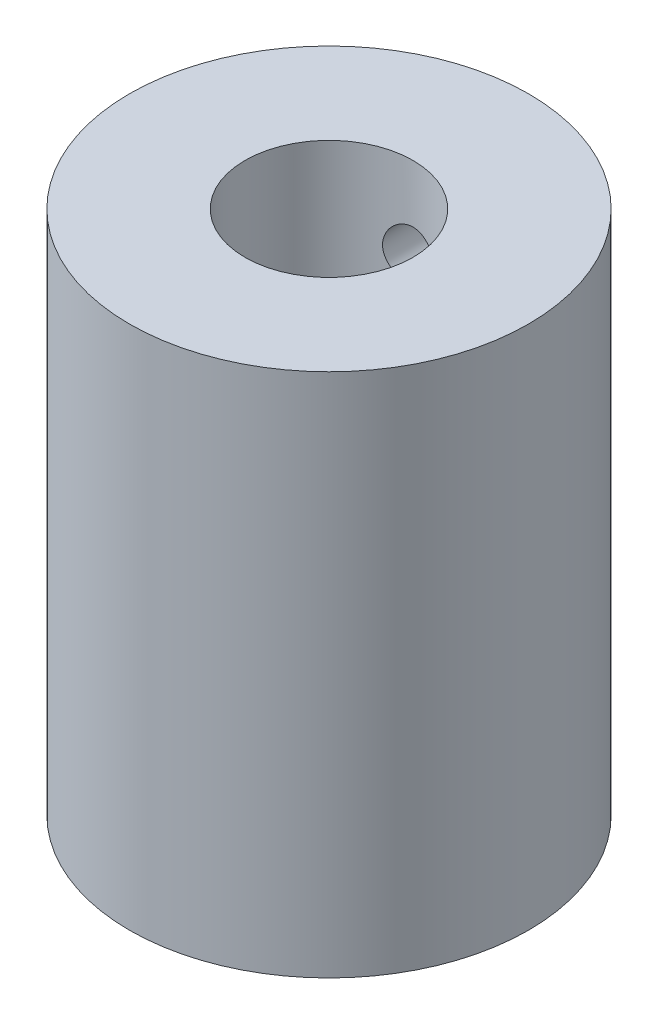
ISO-10303-21;
HEADER;
FILE_DESCRIPTION(('STEP AP214'),'2;1');
FILE_NAME('part.step','',(''),(''),'','','');
FILE_SCHEMA(('AUTOMOTIVE_DESIGN { 1 0 10303 214 1 1 1 1 }'));
ENDSEC;
DATA;
#1=APPLICATION_CONTEXT('core data for automotive mechanical design processes');
#2=APPLICATION_PROTOCOL_DEFINITION('international standard','automotive_design',2000,#1);
#3=PRODUCT_CONTEXT('',#1,'mechanical');
#4=PRODUCT('Part','Part','',(#3));
#5=PRODUCT_RELATED_PRODUCT_CATEGORY('part','',(#4));
#6=PRODUCT_DEFINITION_FORMATION('','',#4);
#7=PRODUCT_DEFINITION_CONTEXT('part definition',#1,'design');
#8=PRODUCT_DEFINITION('design','',#6,#7);
#9=PRODUCT_DEFINITION_SHAPE('','',#8);
#10=(LENGTH_UNIT() NAMED_UNIT(*) SI_UNIT(.MILLI.,.METRE.));
#11=(NAMED_UNIT(*) PLANE_ANGLE_UNIT() SI_UNIT($,.RADIAN.));
#12=(NAMED_UNIT(*) SI_UNIT($,.STERADIAN.) SOLID_ANGLE_UNIT());
#13=UNCERTAINTY_MEASURE_WITH_UNIT(LENGTH_MEASURE(1.E-05),#10,'distance_accuracy_value','');
#14=(GEOMETRIC_REPRESENTATION_CONTEXT(3) GLOBAL_UNCERTAINTY_ASSIGNED_CONTEXT((#13)) GLOBAL_UNIT_ASSIGNED_CONTEXT((#10,
#11,#12)) REPRESENTATION_CONTEXT('',''));
#15=CARTESIAN_POINT('',(0.,0.,0.));
#16=DIRECTION('',(0.,0.,1.));
#17=DIRECTION('',(1.,0.,0.));
#18=AXIS2_PLACEMENT_3D('',#15,#16,#17);
#19=CARTESIAN_POINT('',(0.,25.,0.));
#20=DIRECTION('',(0.,-1.,0.));
#21=DIRECTION('',(0.,0.,-1.));
#22=AXIS2_PLACEMENT_3D('',#19,#20,#21);
#23=CYLINDRICAL_SURFACE('',#22,9.5);
#24=CARTESIAN_POINT('',(0.,22.25,-9.5));
#25=CARTESIAN_POINT('',(-0.0698891577446907,22.249997050473,-9.49999898388699));
#26=CARTESIAN_POINT('',(-0.139821223747716,22.2441188373793,-9.49922063417787));
#27=CARTESIAN_POINT('',(-0.277737237008382,22.2207635020182,-9.49619052111643));
#28=CARTESIAN_POINT('',(-0.345719108974802,22.2032744693628,-9.49393724481659));
#29=CARTESIAN_POINT('',(-0.477718321462633,22.1572235295305,-9.48821096867027));
#30=CARTESIAN_POINT('',(-0.541738376084683,22.1286693023297,-9.4847388149622));
#31=CARTESIAN_POINT('',(-0.664066389164276,22.0613158272721,-9.47696034061076));
#32=CARTESIAN_POINT('',(-0.722375279132386,22.0225182539679,-9.47265415634291));
#33=CARTESIAN_POINT('',(-0.831991543439546,21.9355276905619,-9.46365868232214));
#34=CARTESIAN_POINT('',(-0.883259216449908,21.8872848697635,-9.45896744086581));
#35=CARTESIAN_POINT('',(-0.976995665734435,21.782880323665,-9.44974620597995));
#36=CARTESIAN_POINT('',(-1.01946398005465,21.7267181828718,-9.44521622102649));
#37=CARTESIAN_POINT('',(-1.09454581169274,21.6078089492471,-9.43681128294316));
#38=CARTESIAN_POINT('',(-1.1271218181455,21.5450379779733,-9.43293884705226));
#39=CARTESIAN_POINT('',(-1.18125473128303,21.4148566548344,-9.42631346347733));
#40=CARTESIAN_POINT('',(-1.20281210020545,21.3474464977203,-9.42356046883313));
#41=CARTESIAN_POINT('',(-1.23417446556436,21.2103138855888,-9.41950447444247));
#42=CARTESIAN_POINT('',(-1.24404675286152,21.1406070698532,-9.41819317554674));
#43=CARTESIAN_POINT('',(-1.25196699771812,21.0005147107269,-9.41714370405327));
#44=CARTESIAN_POINT('',(-1.25001548050153,20.930129197623,-9.41740546157894));
#45=CARTESIAN_POINT('',(-1.23439868875379,20.7911479510278,-9.41946493300181));
#46=CARTESIAN_POINT('',(-1.22080773813354,20.7225437010316,-9.4212529010043));
#47=CARTESIAN_POINT('',(-1.18241393441075,20.5885981186233,-9.42614812938148));
#48=CARTESIAN_POINT('',(-1.15761083179558,20.5232568588609,-9.42925541911596));
#49=CARTESIAN_POINT('',(-1.09741754548877,20.397462332422,-9.43645015999781));
#50=CARTESIAN_POINT('',(-1.06199526534778,20.3370246004947,-9.44054057510145));
#51=CARTESIAN_POINT('',(-0.981592067178582,20.2229230343496,-9.44923842883531));
#52=CARTESIAN_POINT('',(-0.936610665013907,20.1692595434432,-9.45384589364672));
#53=CARTESIAN_POINT('',(-0.837955139278335,20.0697985245393,-9.46310196431143));
#54=CARTESIAN_POINT('',(-0.784216991395047,20.0240644825594,-9.46775061467423));
#55=CARTESIAN_POINT('',(-0.669793294455651,19.9422555798297,-9.47653227200754));
#56=CARTESIAN_POINT('',(-0.609107726288853,19.906180745651,-9.48066527755955));
#57=CARTESIAN_POINT('',(-0.482461378646902,19.8447134565616,-9.48795293479305));
#58=CARTESIAN_POINT('',(-0.416498536315513,19.8193252034944,-9.49110720151756));
#59=CARTESIAN_POINT('',(-0.281195165615937,19.7800033282812,-9.49607856940107));
#60=CARTESIAN_POINT('',(-0.211854812774668,19.7660691115481,-9.49789573996917));
#61=CARTESIAN_POINT('',(-0.0723134207975204,19.7501336576661,-9.49997910680566));
#62=CARTESIAN_POINT('',(-0.00212252698949587,19.7480450090038,-9.50025666394529));
#63=CARTESIAN_POINT('',(0.137608332633313,19.7556289713268,-9.49926026666329));
#64=CARTESIAN_POINT('',(0.207148313805827,19.7653013041134,-9.49798634894085));
#65=CARTESIAN_POINT('',(0.343343754575,19.7960600295161,-9.4940372010179));
#66=CARTESIAN_POINT('',(0.410008839502246,19.8171045194689,-9.4913671163958));
#67=CARTESIAN_POINT('',(0.538863845308025,19.8699664656117,-9.48492442408429));
#68=CARTESIAN_POINT('',(0.601053599344464,19.901784323185,-9.48115177531735));
#69=CARTESIAN_POINT('',(0.719581517776561,19.9754997174083,-9.47289589414175));
#70=CARTESIAN_POINT('',(0.775884405799816,20.0174535289432,-9.46840874397782));
#71=CARTESIAN_POINT('',(0.880680914767181,20.1101706170332,-9.45923747369867));
#72=CARTESIAN_POINT('',(0.929174190660316,20.160934282627,-9.45455334489189));
#73=CARTESIAN_POINT('',(1.01728702566563,20.2702161629121,-9.4454807524801));
#74=CARTESIAN_POINT('',(1.05684847689665,20.3287814254935,-9.44109434790601));
#75=CARTESIAN_POINT('',(1.12557262175275,20.4517768382251,-9.43314836944188));
#76=CARTESIAN_POINT('',(1.15473554253827,20.5162068602184,-9.42958877749035));
#77=CARTESIAN_POINT('',(1.20174170294375,20.6489188776009,-9.42371371765608));
#78=CARTESIAN_POINT('',(1.21961716525157,20.7171892964293,-9.42139471115488));
#79=CARTESIAN_POINT('',(1.24364448346356,20.855795422781,-9.41825342941145));
#80=CARTESIAN_POINT('',(1.24979694873515,20.9261310227621,-9.4174310763725));
#81=CARTESIAN_POINT('',(1.25019162856568,21.0662926089517,-9.4173786418146));
#82=CARTESIAN_POINT('',(1.24452514640518,21.1361183509715,-9.41813635402617));
#83=CARTESIAN_POINT('',(1.22163669578697,21.2738155072501,-9.42113236258287));
#84=CARTESIAN_POINT('',(1.20441473040899,21.3416869220298,-9.42337065853341));
#85=CARTESIAN_POINT('',(1.15893367377168,21.4735334905478,-9.42907173824993));
#86=CARTESIAN_POINT('',(1.13067947521131,21.5375103569659,-9.43253397914272));
#87=CARTESIAN_POINT('',(1.06394495730012,21.6598298621194,-9.44029367351982));
#88=CARTESIAN_POINT('',(1.02546445538392,21.7181724002425,-9.44459114191468));
#89=CARTESIAN_POINT('',(0.93903254262036,21.8280332172149,-9.45357680022683));
#90=CARTESIAN_POINT('',(0.891013165736418,21.8794978116378,-9.45826764573149));
#91=CARTESIAN_POINT('',(0.787009174319997,21.9736727218722,-9.46748837677969));
#92=CARTESIAN_POINT('',(0.731022691916985,22.0163809790324,-9.47201822426547));
#93=CARTESIAN_POINT('',(0.612401395289747,22.0919861195341,-9.48042783846154));
#94=CARTESIAN_POINT('',(0.549739600834487,22.1248409679122,-9.48430478993119));
#95=CARTESIAN_POINT('',(0.419770486521843,22.1795136505256,-9.49094356757333));
#96=CARTESIAN_POINT('',(0.352468245550861,22.2013433403341,-9.4937065909269));
#97=CARTESIAN_POINT('',(0.237357221483918,22.2281872631123,-9.4971487575473));
#98=CARTESIAN_POINT('',(0.190270842343245,22.2363551034862,-9.4982126958584));
#99=CARTESIAN_POINT('',(0.0954629792925206,22.247262456279,-9.4996386611571));
#100=CARTESIAN_POINT('',(0.047741500783431,22.250002014831,-9.50000069410996));
#101=CARTESIAN_POINT('',(0.,22.25,-9.5));
#102=B_SPLINE_CURVE_WITH_KNOTS('',3,(#24,#25,#26,#27,#28,#29,#30,#31,#32,#33,#34,#35,#36,#37,
#38,#39,#40,#41,#42,#43,#44,#45,#46,#47,#48,#49,#50,#51,#52,#53,#54,#55,#56,#57,#58,#59,#60,#61,
#62,#63,#64,#65,#66,#67,#68,#69,#70,#71,#72,#73,#74,#75,#76,#77,#78,#79,#80,#81,#82,#83,#84,#85,
#86,#87,#88,#89,#90,#91,#92,#93,#94,#95,#96,#97,#98,#99,#100,#101),.UNSPECIFIED.,.T.,.F.,(4,2,2,
2,2,2,2,2,2,2,2,2,2,2,2,2,2,2,2,2,2,2,2,2,2,2,2,2,2,2,2,2,2,2,2,2,2,2,4),(0.,0.209493072375358,
0.419201375647517,0.628764387445856,0.838293161679495,1.04895868548499,1.25963526613331,
1.47110101760716,1.68255789725311,1.89279104241027,2.10301484889148,2.31190619019212,
2.52080218034093,2.73033603555644,2.93988050546709,3.15103211195918,3.36218429929279,
3.57341943191217,3.78464359847392,3.99430703870755,4.2039655195776,4.41285669353145,
4.62175565100023,4.83184220415876,5.04193803699637,5.25336364761438,5.46478463926429,
5.67559931873913,5.88640303965957,6.09558430110588,6.30476550680216,6.51385404763951,
6.72294632148713,6.93358560809511,7.14427436023559,7.35584953436963,7.56719671049371,
7.71030329529443,7.85340866387632),.UNSPECIFIED.);
#103=CARTESIAN_POINT('',(0.,22.25,-9.5));
#104=VERTEX_POINT('',#103);
#105=EDGE_CURVE('E60',#104,#104,#102,.T.);
#106=ORIENTED_EDGE('',*,*,#105,.T.);
#107=EDGE_LOOP('',(#106));
#108=FACE_BOUND('',#107,.T.);
#109=CARTESIAN_POINT('',(0.,5.25,-9.5));
#110=CARTESIAN_POINT('',(-0.0698891577446909,5.24999705047304,-9.49999898388699));
#111=CARTESIAN_POINT('',(-0.139821223747717,5.24411883737926,-9.49922063417787));
#112=CARTESIAN_POINT('',(-0.277737237008383,5.22076350201818,-9.49619052111643));
#113=CARTESIAN_POINT('',(-0.345719108974802,5.20327446936276,-9.49393724481659));
#114=CARTESIAN_POINT('',(-0.477718321462632,5.15722352953051,-9.48821096867027));
#115=CARTESIAN_POINT('',(-0.541738376084683,5.12866930232967,-9.4847388149622));
#116=CARTESIAN_POINT('',(-0.664066389164277,5.06131582727207,-9.47696034061076));
#117=CARTESIAN_POINT('',(-0.722375279132386,5.02251825396788,-9.47265415634291));
#118=CARTESIAN_POINT('',(-0.831991543439546,4.93552769056193,-9.46365868232214));
#119=CARTESIAN_POINT('',(-0.883259216449907,4.88728486976353,-9.45896744086581));
#120=CARTESIAN_POINT('',(-0.976995665734434,4.78288032366504,-9.44974620597995));
#121=CARTESIAN_POINT('',(-1.01946398005465,4.7267181828718,-9.44521622102649));
#122=CARTESIAN_POINT('',(-1.09454581169274,4.60780894924709,-9.43681128294316));
#123=CARTESIAN_POINT('',(-1.1271218181455,4.54503797797326,-9.43293884705226));
#124=CARTESIAN_POINT('',(-1.18125473128303,4.41485665483443,-9.42631346347733));
#125=CARTESIAN_POINT('',(-1.20281210020545,4.34744649772033,-9.42356046883313));
#126=CARTESIAN_POINT('',(-1.23417446556436,4.21031388558879,-9.41950447444247));
#127=CARTESIAN_POINT('',(-1.24404675286152,4.14060706985325,-9.41819317554674));
#128=CARTESIAN_POINT('',(-1.25196699771812,4.00051471072687,-9.41714370405327));
#129=CARTESIAN_POINT('',(-1.25001548050153,3.93012919762304,-9.41740546157894));
#130=CARTESIAN_POINT('',(-1.23439868875379,3.79114795102776,-9.41946493300181));
#131=CARTESIAN_POINT('',(-1.22080773813354,3.7225437010316,-9.4212529010043));
#132=CARTESIAN_POINT('',(-1.18241393441075,3.58859811862327,-9.42614812938148));
#133=CARTESIAN_POINT('',(-1.15761083179558,3.52325685886086,-9.42925541911596));
#134=CARTESIAN_POINT('',(-1.09741754548877,3.39746233242199,-9.43645015999781));
#135=CARTESIAN_POINT('',(-1.06199526534778,3.33702460049469,-9.44054057510145));
#136=CARTESIAN_POINT('',(-0.981592067178583,3.2229230343496,-9.44923842883531));
#137=CARTESIAN_POINT('',(-0.936610665013909,3.16925954344319,-9.45384589364672));
#138=CARTESIAN_POINT('',(-0.837955139278338,3.0697985245393,-9.46310196431143));
#139=CARTESIAN_POINT('',(-0.78421699139505,3.02406448255941,-9.46775061467423));
#140=CARTESIAN_POINT('',(-0.669793294455654,2.94225557982972,-9.47653227200753));
#141=CARTESIAN_POINT('',(-0.609107726288855,2.906180745651,-9.48066527755955));
#142=CARTESIAN_POINT('',(-0.482461378646903,2.84471345656164,-9.48795293479305));
#143=CARTESIAN_POINT('',(-0.416498536315515,2.81932520349437,-9.49110720151756));
#144=CARTESIAN_POINT('',(-0.281195165615939,2.78000332828116,-9.49607856940107));
#145=CARTESIAN_POINT('',(-0.21185481277467,2.7660691115481,-9.49789573996917));
#146=CARTESIAN_POINT('',(-0.0723134207975215,2.75013365766614,-9.49997910680566));
#147=CARTESIAN_POINT('',(-0.0021225269894969,2.74804500900382,-9.50025666394529));
#148=CARTESIAN_POINT('',(0.137608332633312,2.75562897132685,-9.49926026666329));
#149=CARTESIAN_POINT('',(0.207148313805826,2.7653013041134,-9.49798634894085));
#150=CARTESIAN_POINT('',(0.343343754574999,2.79606002951612,-9.4940372010179));
#151=CARTESIAN_POINT('',(0.410008839502246,2.81710451946888,-9.4913671163958));
#152=CARTESIAN_POINT('',(0.538863845308025,2.86996646561167,-9.48492442408429));
#153=CARTESIAN_POINT('',(0.601053599344464,2.90178432318504,-9.48115177531735));
#154=CARTESIAN_POINT('',(0.71958151777656,2.97549971740826,-9.47289589414175));
#155=CARTESIAN_POINT('',(0.775884405799814,3.01745352894318,-9.46840874397782));
#156=CARTESIAN_POINT('',(0.88068091476718,3.11017061703318,-9.45923747369867));
#157=CARTESIAN_POINT('',(0.929174190660315,3.16093428262702,-9.45455334489189));
#158=CARTESIAN_POINT('',(1.01728702566563,3.2702161629121,-9.4454807524801));
#159=CARTESIAN_POINT('',(1.05684847689665,3.32878142549349,-9.44109434790601));
#160=CARTESIAN_POINT('',(1.12557262175275,3.45177683822505,-9.43314836944188));
#161=CARTESIAN_POINT('',(1.15473554253827,3.51620686021838,-9.42958877749035));
#162=CARTESIAN_POINT('',(1.20174170294375,3.64891887760088,-9.42371371765608));
#163=CARTESIAN_POINT('',(1.21961716525157,3.71718929642928,-9.42139471115488));
#164=CARTESIAN_POINT('',(1.24364448346356,3.85579542278099,-9.41825342941145));
#165=CARTESIAN_POINT('',(1.24979694873515,3.92613102276212,-9.4174310763725));
#166=CARTESIAN_POINT('',(1.25019162856568,4.06629260895167,-9.4173786418146));
#167=CARTESIAN_POINT('',(1.24452514640518,4.13611835097151,-9.41813635402617));
#168=CARTESIAN_POINT('',(1.22163669578697,4.27381550725014,-9.42113236258287));
#169=CARTESIAN_POINT('',(1.20441473040899,4.34168692202977,-9.42337065853341));
#170=CARTESIAN_POINT('',(1.15893367377168,4.47353349054783,-9.42907173824993));
#171=CARTESIAN_POINT('',(1.13067947521131,4.5375103569659,-9.43253397914272));
#172=CARTESIAN_POINT('',(1.06394495730012,4.6598298621194,-9.44029367351982));
#173=CARTESIAN_POINT('',(1.02546445538392,4.71817240024245,-9.44459114191468));
#174=CARTESIAN_POINT('',(0.93903254262036,4.82803321721491,-9.45357680022683));
#175=CARTESIAN_POINT('',(0.891013165736418,4.87949781163776,-9.45826764573149));
#176=CARTESIAN_POINT('',(0.787009174319998,4.97367272187225,-9.46748837677969));
#177=CARTESIAN_POINT('',(0.731022691916986,5.01638097903239,-9.47201822426547));
#178=CARTESIAN_POINT('',(0.612401395289748,5.09198611953406,-9.48042783846154));
#179=CARTESIAN_POINT('',(0.549739600834487,5.12484096791219,-9.48430478993119));
#180=CARTESIAN_POINT('',(0.419770486521842,5.1795136505256,-9.49094356757333));
#181=CARTESIAN_POINT('',(0.35246824555086,5.20134334033409,-9.4937065909269));
#182=CARTESIAN_POINT('',(0.237357221483918,5.22818726311234,-9.4971487575473));
#183=CARTESIAN_POINT('',(0.190270842343245,5.23635510348623,-9.4982126958584));
#184=CARTESIAN_POINT('',(0.0954629792925205,5.24726245627903,-9.4996386611571));
#185=CARTESIAN_POINT('',(0.047741500783431,5.25000201483103,-9.50000069410996));
#186=CARTESIAN_POINT('',(0.,5.25,-9.5));
#187=B_SPLINE_CURVE_WITH_KNOTS('',3,(#109,#110,#111,#112,#113,#114,#115,#116,#117,#118,#119,
#120,#121,#122,#123,#124,#125,#126,#127,#128,#129,#130,#131,#132,#133,#134,#135,#136,#137,#138,
#139,#140,#141,#142,#143,#144,#145,#146,#147,#148,#149,#150,#151,#152,#153,#154,#155,#156,#157,
#158,#159,#160,#161,#162,#163,#164,#165,#166,#167,#168,#169,#170,#171,#172,#173,#174,#175,#176,
#177,#178,#179,#180,#181,#182,#183,#184,#185,#186),.UNSPECIFIED.,.T.,.F.,(4,2,2,2,2,2,2,2,2,2,2,
2,2,2,2,2,2,2,2,2,2,2,2,2,2,2,2,2,2,2,2,2,2,2,2,2,2,2,4),(0.,0.209493072375358,
0.419201375647517,0.628764387445857,0.838293161679494,1.04895868548499,1.2596352661333,
1.47110101760716,1.68255789725311,1.89279104241026,2.10301484889148,2.31190619019212,
2.52080218034093,2.73033603555643,2.93988050546708,3.15103211195917,3.36218429929279,
3.57341943191217,3.78464359847392,3.99430703870755,4.2039655195776,4.41285669353145,
4.62175565100022,4.83184220415875,5.04193803699637,5.25336364761438,5.46478463926428,
5.67559931873913,5.88640303965957,6.09558430110587,6.30476550680216,6.51385404763951,
6.72294632148713,6.93358560809511,7.14427436023559,7.35584953436962,7.56719671049371,
7.71030329529443,7.85340866387631),.UNSPECIFIED.);
#188=CARTESIAN_POINT('',(0.,5.25,-9.5));
#189=VERTEX_POINT('',#188);
#190=EDGE_CURVE('E59',#189,#189,#187,.T.);
#191=ORIENTED_EDGE('',*,*,#190,.T.);
#192=EDGE_LOOP('',(#191));
#193=FACE_BOUND('',#192,.T.);
#194=CARTESIAN_POINT('',(0.,25.,0.));
#195=DIRECTION('',(0.,1.,0.));
#196=DIRECTION('',(0.,0.,1.));
#197=AXIS2_PLACEMENT_3D('',#194,#195,#196);
#198=CIRCLE('',#197,9.5);
#199=CARTESIAN_POINT('',(0.,25.,9.5));
#200=VERTEX_POINT('',#199);
#201=EDGE_CURVE('E10',#200,#200,#198,.T.);
#202=ORIENTED_EDGE('',*,*,#201,.F.);
#203=EDGE_LOOP('',(#202));
#204=FACE_BOUND('',#203,.T.);
#205=CARTESIAN_POINT('',(0.,0.,0.));
#206=DIRECTION('',(0.,1.,0.));
#207=DIRECTION('',(0.,0.,1.));
#208=AXIS2_PLACEMENT_3D('',#205,#206,#207);
#209=CIRCLE('',#208,9.5);
#210=CARTESIAN_POINT('',(0.,0.,9.5));
#211=VERTEX_POINT('',#210);
#212=EDGE_CURVE('E43',#211,#211,#209,.T.);
#213=ORIENTED_EDGE('',*,*,#212,.T.);
#214=EDGE_LOOP('',(#213));
#215=FACE_BOUND('',#214,.T.);
#216=ADVANCED_FACE('F31',(#108,#193,#204,#215),#23,.T.);
#217=CARTESIAN_POINT('',(0.,25.,0.));
#218=DIRECTION('',(0.,1.,0.));
#219=DIRECTION('',(0.,0.,1.));
#220=AXIS2_PLACEMENT_3D('',#217,#218,#219);
#221=PLANE('',#220);
#222=CARTESIAN_POINT('',(0.,25.,0.));
#223=DIRECTION('',(0.,1.,0.));
#224=DIRECTION('',(0.,0.,1.));
#225=AXIS2_PLACEMENT_3D('',#222,#223,#224);
#226=CIRCLE('',#225,4.);
#227=CARTESIAN_POINT('',(0.,25.,4.));
#228=VERTEX_POINT('',#227);
#229=EDGE_CURVE('E51',#228,#228,#226,.T.);
#230=ORIENTED_EDGE('',*,*,#229,.F.);
#231=EDGE_LOOP('',(#230));
#232=FACE_BOUND('',#231,.T.);
#233=ORIENTED_EDGE('',*,*,#201,.T.);
#234=EDGE_LOOP('',(#233));
#235=FACE_BOUND('',#234,.T.);
#236=ADVANCED_FACE('F92',(#232,#235),#221,.T.);
#237=CARTESIAN_POINT('',(0.,0.,0.));
#238=DIRECTION('',(0.,1.,0.));
#239=DIRECTION('',(0.,0.,1.));
#240=AXIS2_PLACEMENT_3D('',#237,#238,#239);
#241=PLANE('',#240);
#242=CARTESIAN_POINT('',(0.,0.,0.));
#243=DIRECTION('',(0.,-1.,0.));
#244=DIRECTION('',(0.,0.,-1.));
#245=AXIS2_PLACEMENT_3D('',#242,#243,#244);
#246=CIRCLE('',#245,2.5);
#247=CARTESIAN_POINT('',(0.,0.,-2.5));
#248=VERTEX_POINT('',#247);
#249=EDGE_CURVE('E77',#248,#248,#246,.T.);
#250=ORIENTED_EDGE('',*,*,#249,.F.);
#251=EDGE_LOOP('',(#250));
#252=FACE_BOUND('',#251,.T.);
#253=ORIENTED_EDGE('',*,*,#212,.F.);
#254=EDGE_LOOP('',(#253));
#255=FACE_BOUND('',#254,.T.);
#256=ADVANCED_FACE('F94',(#252,#255),#241,.F.);
#257=CARTESIAN_POINT('',(0.,12.5,0.));
#258=DIRECTION('',(0.,1.,0.));
#259=DIRECTION('',(0.,0.,1.));
#260=AXIS2_PLACEMENT_3D('',#257,#258,#259);
#261=CYLINDRICAL_SURFACE('',#260,4.);
#262=CARTESIAN_POINT('',(1.25,21.,-3.79967103839267));
#263=CARTESIAN_POINT('',(1.24999953780047,20.9316529638907,-3.79967145961936));
#264=CARTESIAN_POINT('',(1.24437538791495,20.8633012312968,-3.80153531505043));
#265=CARTESIAN_POINT('',(1.22209175401327,20.7286058391222,-3.80875638998877));
#266=CARTESIAN_POINT('',(1.20542928782515,20.6622627272678,-3.81411455353136));
#267=CARTESIAN_POINT('',(1.16169788223559,20.533555098068,-3.8276593883596));
#268=CARTESIAN_POINT('',(1.13464735736677,20.4711837668943,-3.83584105194317));
#269=CARTESIAN_POINT('',(1.07096914173157,20.351847304136,-3.85410406218688));
#270=CARTESIAN_POINT('',(1.03433975905632,20.2948831300399,-3.8641857443584));
#271=CARTESIAN_POINT('',(0.951196070622296,20.1860211325065,-3.8855012766862));
#272=CARTESIAN_POINT('',(0.904409399720402,20.134336390564,-3.8967612338478));
#273=CARTESIAN_POINT('',(0.802862046455498,20.0394039867908,-3.91894245860336));
#274=CARTESIAN_POINT('',(0.748100252518568,19.9961575030552,-3.92986367872627));
#275=CARTESIAN_POINT('',(0.630625912493366,19.9183889369888,-3.95043553390078));
#276=CARTESIAN_POINT('',(0.567761556520099,19.8840862961685,-3.9600518456278));
#277=CARTESIAN_POINT('',(0.436804232853408,19.8266239501445,-3.97662551833019));
#278=CARTESIAN_POINT('',(0.368712498487056,19.8034616258504,-3.98358350419919));
#279=CARTESIAN_POINT('',(0.231464356966102,19.7696488719029,-3.99387175820862));
#280=CARTESIAN_POINT('',(0.162405715468219,19.7586342502122,-3.99730738984143));
#281=CARTESIAN_POINT('',(0.0233408139845235,19.7482756535625,-4.00053595876015));
#282=CARTESIAN_POINT('',(-0.0466652269730806,19.7489290256412,-4.00032972410065));
#283=CARTESIAN_POINT('',(-0.183074480354732,19.7616482915859,-3.99637116132537));
#284=CARTESIAN_POINT('',(-0.249518634314041,19.773319383513,-3.99274150972157));
#285=CARTESIAN_POINT('',(-0.379453063347768,19.807094990043,-3.98249482560855));
#286=CARTESIAN_POINT('',(-0.442943145481193,19.8292001850866,-3.97587759827134));
#287=CARTESIAN_POINT('',(-0.566078103154779,19.8834701890749,-3.96023459729533));
#288=CARTESIAN_POINT('',(-0.625666405622829,19.915754808563,-3.95118033616957));
#289=CARTESIAN_POINT('',(-0.738702511152028,19.9893710997046,-3.93161722953562));
#290=CARTESIAN_POINT('',(-0.792148756208836,20.0307050591378,-3.92110801644584));
#291=CARTESIAN_POINT('',(-0.893737698453879,20.1232736348013,-3.89923670734646));
#292=CARTESIAN_POINT('',(-0.941566549094176,20.1748490688412,-3.88785731989084));
#293=CARTESIAN_POINT('',(-1.02798974259537,20.2853951018245,-3.86590615440413));
#294=CARTESIAN_POINT('',(-1.06658299775341,20.344366570575,-3.85533447159847));
#295=CARTESIAN_POINT('',(-1.13380465019765,20.4689174688598,-3.83610846648974));
#296=CARTESIAN_POINT('',(-1.16231680702682,20.5345634090424,-3.82747690354324));
#297=CARTESIAN_POINT('',(-1.20778345948513,20.6700594918954,-3.81337545338913));
#298=CARTESIAN_POINT('',(-1.22474210765793,20.7399081142105,-3.80790443033294));
#299=CARTESIAN_POINT('',(-1.24601485185708,20.8788199525658,-3.80099563391872));
#300=CARTESIAN_POINT('',(-1.25080954353711,20.9478019962321,-3.79940466389696));
#301=CARTESIAN_POINT('',(-1.24896744498307,21.0855897414982,-3.80001077463985));
#302=CARTESIAN_POINT('',(-1.24233242111456,21.1543954687005,-3.80220727008389));
#303=CARTESIAN_POINT('',(-1.21824873513143,21.2878082966517,-3.80998957482874));
#304=CARTESIAN_POINT('',(-1.20111831160537,21.352479274074,-3.81547554101732));
#305=CARTESIAN_POINT('',(-1.15690373661027,21.478021791996,-3.82911287331661));
#306=CARTESIAN_POINT('',(-1.12981796171154,21.5388927109212,-3.83726467412388));
#307=CARTESIAN_POINT('',(-1.06557510655874,21.6570391097718,-3.85560539653156));
#308=CARTESIAN_POINT('',(-1.02815147488557,21.7141614155928,-3.86584603489733));
#309=CARTESIAN_POINT('',(-0.944606408679807,21.8214903463619,-3.88710348972829));
#310=CARTESIAN_POINT('',(-0.89848271469078,21.8716951689253,-3.89812050735703));
#311=CARTESIAN_POINT('',(-0.796572947753601,21.9659103659128,-3.92024187562679));
#312=CARTESIAN_POINT('',(-0.740465649788516,22.0095777861399,-3.9313309228568));
#313=CARTESIAN_POINT('',(-0.621451545651392,22.0868910433213,-3.95189059843678));
#314=CARTESIAN_POINT('',(-0.558545051108618,22.120537339311,-3.96136130090946));
#315=CARTESIAN_POINT('',(-0.428105523331827,22.1765305624717,-3.97756311928512));
#316=CARTESIAN_POINT('',(-0.360610184283751,22.1989592878437,-3.984313995612));
#317=CARTESIAN_POINT('',(-0.222557254056386,22.2320725385897,-3.99440242648576));
#318=CARTESIAN_POINT('',(-0.152000628340353,22.2427607390835,-3.99774104914277));
#319=CARTESIAN_POINT('',(-0.0129849366488962,22.2517910017496,-4.00055803404462));
#320=CARTESIAN_POINT('',(0.0554391919465246,22.2506284501708,-4.0001912940739));
#321=CARTESIAN_POINT('',(0.19107322192325,22.2371881889513,-3.99600978081049));
#322=CARTESIAN_POINT('',(0.258283202179571,22.2249112040081,-3.99219523232619));
#323=CARTESIAN_POINT('',(0.388755118480794,22.1899059907777,-3.98159570844796));
#324=CARTESIAN_POINT('',(0.452055918449484,22.1673103921546,-3.97484847960205));
#325=CARTESIAN_POINT('',(0.573998425500094,22.1124291727915,-3.9590794558795));
#326=CARTESIAN_POINT('',(0.632639331274485,22.0801418900266,-3.95005727091358));
#327=CARTESIAN_POINT('',(0.745761694969692,22.0055272416556,-3.93029896883376));
#328=CARTESIAN_POINT('',(0.800034607053115,21.962896477536,-3.91951509750962));
#329=CARTESIAN_POINT('',(0.900820791399323,21.8693401105565,-3.89758736547061));
#330=CARTESIAN_POINT('',(0.947331733504164,21.8184120258606,-3.88644339784826));
#331=CARTESIAN_POINT('',(1.03282865911253,21.7076842801589,-3.86461892577438));
#332=CARTESIAN_POINT('',(1.07151427994712,21.6476465968834,-3.85396600863456));
#333=CARTESIAN_POINT('',(1.13820470748522,21.5216018797309,-3.83480125279531));
#334=CARTESIAN_POINT('',(1.16621383403546,21.4555972735497,-3.82628854861386));
#335=CARTESIAN_POINT('',(1.20871180435793,21.3252773826853,-3.81306560440327));
#336=CARTESIAN_POINT('',(1.22414939837874,21.2612974525484,-3.80809315043749));
#337=CARTESIAN_POINT('',(1.244792458161,21.1315461679035,-3.80139606482398));
#338=CARTESIAN_POINT('',(1.25000044480779,21.0657752587985,-3.79967063301598));
#339=CARTESIAN_POINT('',(1.25,21.,-3.79967103839267));
#340=B_SPLINE_CURVE_WITH_KNOTS('',3,(#262,#263,#264,#265,#266,#267,#268,#269,#270,#271,#272,
#273,#274,#275,#276,#277,#278,#279,#280,#281,#282,#283,#284,#285,#286,#287,#288,#289,#290,#291,
#292,#293,#294,#295,#296,#297,#298,#299,#300,#301,#302,#303,#304,#305,#306,#307,#308,#309,#310,
#311,#312,#313,#314,#315,#316,#317,#318,#319,#320,#321,#322,#323,#324,#325,#326,#327,#328,#329,
#330,#331,#332,#333,#334,#335,#336,#337,#338,#339),.UNSPECIFIED.,.T.,.F.,(4,2,2,2,2,2,2,2,2,2,2,
2,2,2,2,2,2,2,2,2,2,2,2,2,2,2,2,2,2,2,2,2,2,2,2,2,2,2,4),(0.,0.20479813754849,0.409651627059736,
0.614143644118583,0.818671804924948,1.02957080550838,1.24049922941123,1.45619821963733,
1.67184647417922,1.88083722835534,2.08978046471775,2.29150982969751,2.49325235190093,
2.69746404608409,2.90172742713188,3.11450338937334,3.32730439853776,3.54248470934454,
3.75758763952753,3.96404933287936,4.1704791221909,4.37093972044363,4.5714330225321,
4.77767613309612,4.98397288011881,5.19881937811512,5.41365603317087,5.62690239290999,
5.84008198140585,6.04438802439525,6.24868074692307,6.4504184651476,6.65219079911652,
6.86080693105216,7.06948557772191,7.28507795501706,7.50058300803823,7.69772354371387,
7.8948154918878),.UNSPECIFIED.);
#341=CARTESIAN_POINT('',(1.25,21.,-3.79967103839267));
#342=VERTEX_POINT('',#341);
#343=EDGE_CURVE('E35',#342,#342,#340,.T.);
#344=ORIENTED_EDGE('',*,*,#343,.T.);
#345=EDGE_LOOP('',(#344));
#346=FACE_BOUND('',#345,.T.);
#347=CARTESIAN_POINT('',(0.,12.5,0.));
#348=DIRECTION('',(0.,1.,0.));
#349=DIRECTION('',(0.,0.,1.));
#350=AXIS2_PLACEMENT_3D('',#347,#348,#349);
#351=CIRCLE('',#350,4.);
#352=CARTESIAN_POINT('',(0.,12.5,4.));
#353=VERTEX_POINT('',#352);
#354=EDGE_CURVE('E48',#353,#353,#351,.T.);
#355=ORIENTED_EDGE('',*,*,#354,.F.);
#356=EDGE_LOOP('',(#355));
#357=FACE_BOUND('',#356,.T.);
#358=ORIENTED_EDGE('',*,*,#229,.T.);
#359=EDGE_LOOP('',(#358));
#360=FACE_BOUND('',#359,.T.);
#361=ADVANCED_FACE('F90',(#346,#357,#360),#261,.F.);
#362=CARTESIAN_POINT('',(0.,12.5,0.));
#363=DIRECTION('',(0.,1.,0.));
#364=DIRECTION('',(0.,0.,1.));
#365=AXIS2_PLACEMENT_3D('',#362,#363,#364);
#366=PLANE('',#365);
#367=CARTESIAN_POINT('',(0.,12.5,0.));
#368=DIRECTION('',(0.,-1.,0.));
#369=DIRECTION('',(0.,0.,-1.));
#370=AXIS2_PLACEMENT_3D('',#367,#368,#369);
#371=CIRCLE('',#370,2.5);
#372=CARTESIAN_POINT('',(0.,12.5,-2.5));
#373=VERTEX_POINT('',#372);
#374=EDGE_CURVE('E80',#373,#373,#371,.T.);
#375=ORIENTED_EDGE('',*,*,#374,.T.);
#376=EDGE_LOOP('',(#375));
#377=FACE_BOUND('',#376,.T.);
#378=ORIENTED_EDGE('',*,*,#354,.T.);
#379=EDGE_LOOP('',(#378));
#380=FACE_BOUND('',#379,.T.);
#381=ADVANCED_FACE('F104',(#377,#380),#366,.T.);
#382=CARTESIAN_POINT('',(0.,12.5,0.));
#383=DIRECTION('',(0.,-1.,0.));
#384=DIRECTION('',(0.,0.,-1.));
#385=AXIS2_PLACEMENT_3D('',#382,#383,#384);
#386=CYLINDRICAL_SURFACE('',#385,2.5);
#387=CARTESIAN_POINT('',(0.,5.25,-2.5));
#388=CARTESIAN_POINT('',(0.0657149536912331,5.24999587210062,-2.49999641755189));
#389=CARTESIAN_POINT('',(0.131508249622541,5.24478740859791,-2.49738113774397));
#390=CARTESIAN_POINT('',(0.261150294085532,5.22418389957385,-2.48717695046745));
#391=CARTESIAN_POINT('',(0.32499510839188,5.20876950875294,-2.47957859786229));
#392=CARTESIAN_POINT('',(0.448666931100718,5.16850773922901,-2.46020349254139));
#393=CARTESIAN_POINT('',(0.508508503673975,5.14369701968999,-2.448442989719));
#394=CARTESIAN_POINT('',(0.623090771008207,5.08553672329383,-2.42182220644723));
#395=CARTESIAN_POINT('',(0.677831867487563,5.05218781968894,-2.40696217041912));
#396=CARTESIAN_POINT('',(0.784384772202399,4.97560343814338,-2.37445322822571));
#397=CARTESIAN_POINT('',(0.83581901390264,4.93189190095045,-2.3566899890942));
#398=CARTESIAN_POINT('',(0.930974306083722,4.83684815094121,-2.3207496280843));
#399=CARTESIAN_POINT('',(0.974689478883459,4.78551018528445,-2.30257220261294));
#400=CARTESIAN_POINT('',(1.05656500056285,4.67189581309578,-2.26623688996684));
#401=CARTESIAN_POINT('',(1.09403166943955,4.60907987706761,-2.24818983712665));
#402=CARTESIAN_POINT('',(1.15771028361337,4.47704083001724,-2.21607473465401));
#403=CARTESIAN_POINT('',(1.18393026870792,4.40782233909657,-2.20200384508737));
#404=CARTESIAN_POINT('',(1.22266555273574,4.2691686182226,-2.1807233379726));
#405=CARTESIAN_POINT('',(1.23590732135055,4.19999443491576,-2.17315339479642));
#406=CARTESIAN_POINT('',(1.25053374163606,4.06002645277566,-2.16477362435659));
#407=CARTESIAN_POINT('',(1.25193011046635,3.98923432391106,-2.1639571167911));
#408=CARTESIAN_POINT('',(1.24335910896537,3.85714246960579,-2.1688866282156));
#409=CARTESIAN_POINT('',(1.23473069942103,3.79571996097119,-2.17385954577517));
#410=CARTESIAN_POINT('',(1.20867481132117,3.6753476132837,-2.18845285917313));
#411=CARTESIAN_POINT('',(1.19124452987207,3.61639856836836,-2.1980747353972));
#412=CARTESIAN_POINT('',(1.14776222548251,3.50096358429293,-2.22109345515926));
#413=CARTESIAN_POINT('',(1.121518833895,3.44456700151777,-2.23457300829998));
#414=CARTESIAN_POINT('',(1.06130210958501,3.33670713426249,-2.26379255351754));
#415=CARTESIAN_POINT('',(1.02732530476559,3.28524608049989,-2.27953355975238));
#416=CARTESIAN_POINT('',(0.947582568640991,3.18184843407097,-2.31391447379107));
#417=CARTESIAN_POINT('',(0.900868072961607,3.13067890802981,-2.33266887795932));
#418=CARTESIAN_POINT('',(0.799444473426722,3.03658072676138,-2.36934529125509));
#419=CARTESIAN_POINT('',(0.744731570717862,2.99365600995765,-2.38726689948501));
#420=CARTESIAN_POINT('',(0.625645632289816,2.91539292371284,-2.42127484103705));
#421=CARTESIAN_POINT('',(0.560941989499267,2.88049940944283,-2.43723730202509));
#422=CARTESIAN_POINT('',(0.425582769361002,2.82237871369624,-2.46447351401553));
#423=CARTESIAN_POINT('',(0.354931970331601,2.79914226873104,-2.47575098679441));
#424=CARTESIAN_POINT('',(0.215958114575883,2.76690574535416,-2.49155417176795));
#425=CARTESIAN_POINT('',(0.147926913185411,2.75688595531653,-2.4965617287664));
#426=CARTESIAN_POINT('',(0.0109744999366975,2.74816908608189,-2.50091266823877));
#427=CARTESIAN_POINT('',(-0.0579462748373715,2.74946664295065,-2.5002587340164));
#428=CARTESIAN_POINT('',(-0.189041214982487,2.76275836052344,-2.49363990316801));
#429=CARTESIAN_POINT('',(-0.251324260062438,2.77391566591254,-2.48809057110237));
#430=CARTESIAN_POINT('',(-0.373008615377391,2.80529758986886,-2.47277714143524));
#431=CARTESIAN_POINT('',(-0.432409607113741,2.8255232080667,-2.46301257917916));
#432=CARTESIAN_POINT('',(-0.548610760562077,2.87499808304146,-2.43980314267087));
#433=CARTESIAN_POINT('',(-0.605287996257688,2.90448881264602,-2.42626102212424));
#434=CARTESIAN_POINT('',(-0.713076702123647,2.97138441955755,-2.39679967896386));
#435=CARTESIAN_POINT('',(-0.764185787219098,3.00879266824179,-2.38087944457232));
#436=CARTESIAN_POINT('',(-0.864709611613312,3.09470053166609,-2.34635276671831));
#437=CARTESIAN_POINT('',(-0.913465097280794,3.14392858556695,-2.32763606060552));
#438=CARTESIAN_POINT('',(-1.00232040139155,3.24990643908663,-2.29077989504843));
#439=CARTESIAN_POINT('',(-1.04241423211355,3.30666139852047,-2.27264084226908));
#440=CARTESIAN_POINT('',(-1.11463489312212,3.42955456775039,-2.23813990282585));
#441=CARTESIAN_POINT('',(-1.14628186984829,3.49601408276074,-2.2219066207934));
#442=CARTESIAN_POINT('',(-1.19760353251725,3.63438758461565,-2.19467590460158));
#443=CARTESIAN_POINT('',(-1.21729364485946,3.70629440812648,-2.18367172800773));
#444=CARTESIAN_POINT('',(-1.2423271093121,3.84613777857681,-2.16951876260834));
#445=CARTESIAN_POINT('',(-1.24886624550108,3.91379281678629,-2.16571729325614));
#446=CARTESIAN_POINT('',(-1.25086144297598,4.04930883396341,-2.16456693307719));
#447=CARTESIAN_POINT('',(-1.2463223082805,4.11716971092429,-2.16721524534441));
#448=CARTESIAN_POINT('',(-1.22740765699033,4.24435437691502,-2.17797327562531));
#449=CARTESIAN_POINT('',(-1.2140103929285,4.3038755876805,-2.18553868102992));
#450=CARTESIAN_POINT('',(-1.17896919778081,4.41976014928088,-2.20463770234897));
#451=CARTESIAN_POINT('',(-1.15732261394976,4.47612247761496,-2.21617259462095));
#452=CARTESIAN_POINT('',(-1.10476968162585,4.58828106373326,-2.2428566295566));
#453=CARTESIAN_POINT('',(-1.07333892227057,4.64378487728713,-2.25819652995238));
#454=CARTESIAN_POINT('',(-1.00268871454579,4.74909317022573,-2.29044164543238));
#455=CARTESIAN_POINT('',(-0.96346521404831,4.79889466314811,-2.30734767243153));
#456=CARTESIAN_POINT('',(-0.872754158330801,4.89767747794702,-2.34327903949141));
#457=CARTESIAN_POINT('',(-0.820355528762713,4.9458238779524,-2.36231229139336));
#458=CARTESIAN_POINT('',(-0.707693507775349,5.03282872927954,-2.3984719031886));
#459=CARTESIAN_POINT('',(-0.647425904070981,5.07168217428286,-2.4155972326005));
#460=CARTESIAN_POINT('',(-0.519914496024934,5.13904545345276,-2.44622511981379));
#461=CARTESIAN_POINT('',(-0.452624379918268,5.16748021176429,-2.45970120703636));
#462=CARTESIAN_POINT('',(-0.313427626617739,5.21226020989869,-2.48126676704332));
#463=CARTESIAN_POINT('',(-0.241534749528958,5.22863980853697,-2.48937154216165));
#464=CARTESIAN_POINT('',(-0.14075243310423,5.24237176384481,-2.49619327387079));
#465=CARTESIAN_POINT('',(-0.112702349299373,5.24522830107953,-2.49761706674002));
#466=CARTESIAN_POINT('',(-0.0564396647589472,5.24904333189601,-2.49952121222331));
#467=CARTESIAN_POINT('',(-0.0282270595592268,5.250001773089,-2.50000153879704));
#468=CARTESIAN_POINT('',(0.,5.25,-2.5));
#469=B_SPLINE_CURVE_WITH_KNOTS('',3,(#387,#388,#389,#390,#391,#392,#393,#394,#395,#396,#397,
#398,#399,#400,#401,#402,#403,#404,#405,#406,#407,#408,#409,#410,#411,#412,#413,#414,#415,#416,
#417,#418,#419,#420,#421,#422,#423,#424,#425,#426,#427,#428,#429,#430,#431,#432,#433,#434,#435,
#436,#437,#438,#439,#440,#441,#442,#443,#444,#445,#446,#447,#448,#449,#450,#451,#452,#453,#454,
#455,#456,#457,#458,#459,#460,#461,#462,#463,#464,#465,#466,#467,#468),.UNSPECIFIED.,.T.,.F.,(4,
2,2,2,2,2,2,2,2,2,2,2,2,2,2,2,2,2,2,2,2,2,2,2,2,2,2,2,2,2,2,2,2,2,2,2,2,2,2,2,4),(0.,
0.197030321775366,0.394435187136497,0.591077694365373,0.78770470072696,0.996227198397611,
1.20490779706754,1.42977158038441,1.65447434872851,1.86572515175287,2.07676696661276,
2.26257140511651,2.44843504907098,2.63862800210609,2.82890651575277,3.04331176667348,
3.25781918248358,3.48228777768051,3.7065777114035,3.91229113089182,4.11790705639345,
4.30758633132653,4.49728652038665,4.69241070034874,4.88761813435424,5.10199513305524,
5.3165198576929,5.54143352699593,5.76605639925972,5.96911634372967,6.17208824825007,
6.35572412805229,6.53941910979598,6.73545570969518,6.93159451423697,7.15156553440623,
7.37165479220716,7.59330017078657,7.81431135781163,7.89894100172122,7.98357298143559),.UNSPECIFIED.);
#470=CARTESIAN_POINT('',(0.,5.25,-2.5));
#471=VERTEX_POINT('',#470);
#472=EDGE_CURVE('E53',#471,#471,#469,.T.);
#473=ORIENTED_EDGE('',*,*,#472,.T.);
#474=EDGE_LOOP('',(#473));
#475=FACE_BOUND('',#474,.T.);
#476=ORIENTED_EDGE('',*,*,#374,.F.);
#477=EDGE_LOOP('',(#476));
#478=FACE_BOUND('',#477,.T.);
#479=ORIENTED_EDGE('',*,*,#249,.T.);
#480=EDGE_LOOP('',(#479));
#481=FACE_BOUND('',#480,.T.);
#482=ADVANCED_FACE('F61',(#475,#478,#481),#386,.F.);
#483=CARTESIAN_POINT('',(0.,4.,-12.5));
#484=DIRECTION('',(0.,0.,1.));
#485=DIRECTION('',(1.,0.,0.));
#486=AXIS2_PLACEMENT_3D('',#483,#484,#485);
#487=CYLINDRICAL_SURFACE('',#486,1.25);
#488=ORIENTED_EDGE('',*,*,#472,.F.);
#489=EDGE_LOOP('',(#488));
#490=FACE_BOUND('',#489,.T.);
#491=ORIENTED_EDGE('',*,*,#190,.F.);
#492=EDGE_LOOP('',(#491));
#493=FACE_BOUND('',#492,.T.);
#494=ADVANCED_FACE('F64',(#490,#493),#487,.F.);
#495=CARTESIAN_POINT('',(0.,21.,-12.5));
#496=DIRECTION('',(0.,0.,1.));
#497=DIRECTION('',(1.,0.,0.));
#498=AXIS2_PLACEMENT_3D('',#495,#496,#497);
#499=CYLINDRICAL_SURFACE('',#498,1.25);
#500=ORIENTED_EDGE('',*,*,#343,.F.);
#501=EDGE_LOOP('',(#500));
#502=FACE_BOUND('',#501,.T.);
#503=ORIENTED_EDGE('',*,*,#105,.F.);
#504=EDGE_LOOP('',(#503));
#505=FACE_BOUND('',#504,.T.);
#506=ADVANCED_FACE('F67',(#502,#505),#499,.F.);
#507=CLOSED_SHELL('',(#216,#236,#256,#361,#381,#482,#494,#506));
#508=MANIFOLD_SOLID_BREP('B2',#507);
#509=ADVANCED_BREP_SHAPE_REPRESENTATION('',(#18,#508),#14);
#510=SHAPE_DEFINITION_REPRESENTATION(#9,#509);
ENDSEC;
END-ISO-10303-21;
